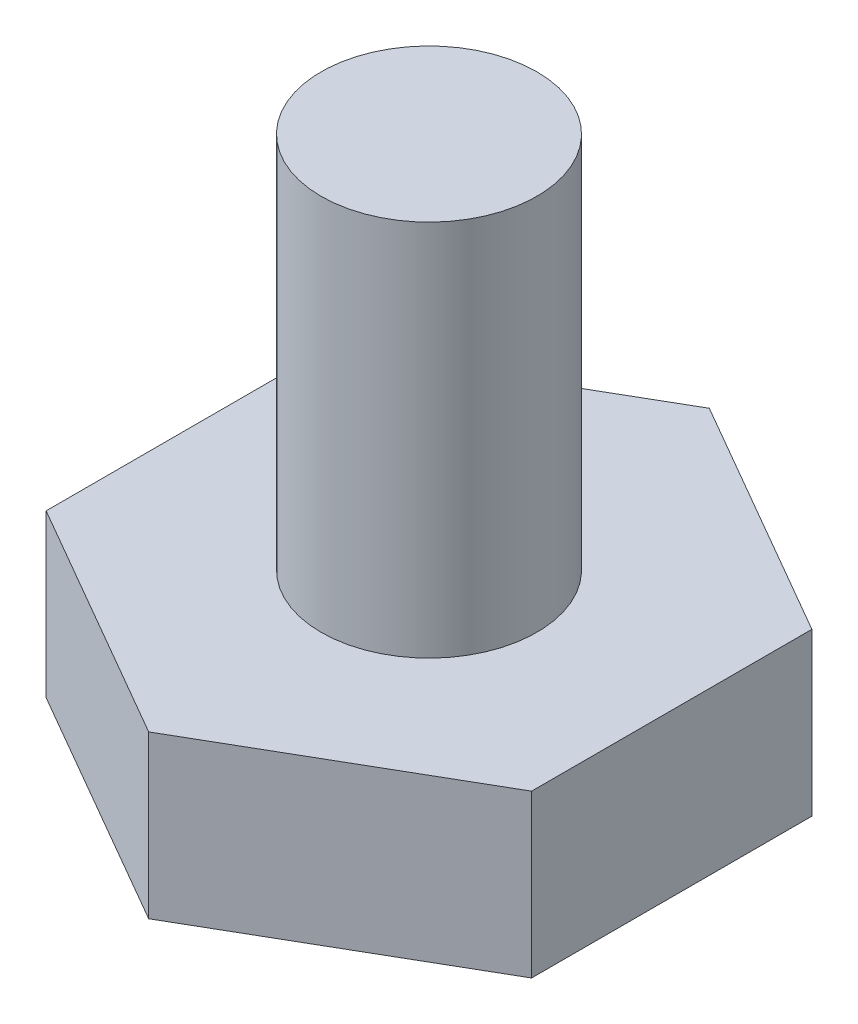
ISO-10303-21;
HEADER;
FILE_DESCRIPTION(('STEP AP214'),'2;1');
FILE_NAME('part.step','',(''),(''),'','','');
FILE_SCHEMA(('AUTOMOTIVE_DESIGN { 1 0 10303 214 1 1 1 1 }'));
ENDSEC;
DATA;
#1=APPLICATION_CONTEXT('core data for automotive mechanical design processes');
#2=APPLICATION_PROTOCOL_DEFINITION('international standard','automotive_design',2000,#1);
#3=PRODUCT_CONTEXT('',#1,'mechanical');
#4=PRODUCT('Part','Part','',(#3));
#5=PRODUCT_RELATED_PRODUCT_CATEGORY('part','',(#4));
#6=PRODUCT_DEFINITION_FORMATION('','',#4);
#7=PRODUCT_DEFINITION_CONTEXT('part definition',#1,'design');
#8=PRODUCT_DEFINITION('design','',#6,#7);
#9=PRODUCT_DEFINITION_SHAPE('','',#8);
#10=(LENGTH_UNIT() NAMED_UNIT(*) SI_UNIT(.MILLI.,.METRE.));
#11=(NAMED_UNIT(*) PLANE_ANGLE_UNIT() SI_UNIT($,.RADIAN.));
#12=(NAMED_UNIT(*) SI_UNIT($,.STERADIAN.) SOLID_ANGLE_UNIT());
#13=UNCERTAINTY_MEASURE_WITH_UNIT(LENGTH_MEASURE(1.E-05),#10,'distance_accuracy_value','');
#14=(GEOMETRIC_REPRESENTATION_CONTEXT(3) GLOBAL_UNCERTAINTY_ASSIGNED_CONTEXT((#13)) GLOBAL_UNIT_ASSIGNED_CONTEXT((#10,
#11,#12)) REPRESENTATION_CONTEXT('',''));
#15=CARTESIAN_POINT('',(0.,0.,0.));
#16=DIRECTION('',(0.,0.,1.));
#17=DIRECTION('',(1.,0.,0.));
#18=AXIS2_PLACEMENT_3D('',#15,#16,#17);
#19=CARTESIAN_POINT('',(7.14374999999995,2.38125,-4.12444598552347));
#20=DIRECTION('',(-0.499999999999995,0.,0.866025403784442));
#21=DIRECTION('',(0.866025403784442,0.,0.499999999999995));
#22=AXIS2_PLACEMENT_3D('',#19,#20,#21);
#23=PLANE('',#22);
#24=DIRECTION('',(-0.866025403784441,0.,-0.499999999999995));
#25=VECTOR('',#24,1.);
#26=CARTESIAN_POINT('',(7.14374999999995,-2.38125,-4.12444598552347));
#27=LINE('',#26,#25);
#28=CARTESIAN_POINT('',(7.14374999999995,-2.38125,-4.12444598552347));
#29=VERTEX_POINT('',#28);
#30=CARTESIAN_POINT('',(0.,-2.38125,-8.24889197104678));
#31=VERTEX_POINT('',#30);
#32=EDGE_CURVE('E125',#29,#31,#27,.T.);
#33=ORIENTED_EDGE('',*,*,#32,.T.);
#34=DIRECTION('',(0.,-1.,0.));
#35=VECTOR('',#34,1.);
#36=CARTESIAN_POINT('',(0.,2.38125,-8.24889197104678));
#37=LINE('',#36,#35);
#38=CARTESIAN_POINT('',(0.,2.38125,-8.24889197104678));
#39=VERTEX_POINT('',#38);
#40=EDGE_CURVE('E42',#39,#31,#37,.T.);
#41=ORIENTED_EDGE('',*,*,#40,.F.);
#42=DIRECTION('',(-0.866025403784441,0.,-0.499999999999995));
#43=VECTOR('',#42,1.);
#44=CARTESIAN_POINT('',(7.14374999999995,2.38125,-4.12444598552347));
#45=LINE('',#44,#43);
#46=CARTESIAN_POINT('',(7.14374999999995,2.38125,-4.12444598552347));
#47=VERTEX_POINT('',#46);
#48=EDGE_CURVE('E136',#47,#39,#45,.T.);
#49=ORIENTED_EDGE('',*,*,#48,.F.);
#50=DIRECTION('',(0.,-1.,0.));
#51=VECTOR('',#50,1.);
#52=CARTESIAN_POINT('',(7.14374999999995,2.38125,-4.12444598552347));
#53=LINE('',#52,#51);
#54=EDGE_CURVE('E121',#47,#29,#53,.T.);
#55=ORIENTED_EDGE('',*,*,#54,.T.);
#56=EDGE_LOOP('',(#33,#41,#49,#55));
#57=FACE_BOUND('',#56,.T.);
#58=ADVANCED_FACE('F39',(#57),#23,.F.);
#59=CARTESIAN_POINT('',(0.,2.38125,-8.24889197104678));
#60=DIRECTION('',(0.500000000000001,0.,0.866025403784438));
#61=DIRECTION('',(0.866025403784438,0.,-0.500000000000001));
#62=AXIS2_PLACEMENT_3D('',#59,#60,#61);
#63=PLANE('',#62);
#64=DIRECTION('',(-0.866025403784438,0.,0.500000000000001));
#65=VECTOR('',#64,1.);
#66=CARTESIAN_POINT('',(0.,-2.38125,-8.24889197104678));
#67=LINE('',#66,#65);
#68=CARTESIAN_POINT('',(-7.14375000000001,-2.38125,-4.12444598552337));
#69=VERTEX_POINT('',#68);
#70=EDGE_CURVE('E128',#31,#69,#67,.T.);
#71=ORIENTED_EDGE('',*,*,#70,.T.);
#72=DIRECTION('',(0.,-1.,0.));
#73=VECTOR('',#72,1.);
#74=CARTESIAN_POINT('',(-7.14375000000001,2.38125,-4.12444598552337));
#75=LINE('',#74,#73);
#76=CARTESIAN_POINT('',(-7.14375000000001,2.38125,-4.12444598552337));
#77=VERTEX_POINT('',#76);
#78=EDGE_CURVE('E139',#77,#69,#75,.T.);
#79=ORIENTED_EDGE('',*,*,#78,.F.);
#80=DIRECTION('',(-0.866025403784438,0.,0.500000000000001));
#81=VECTOR('',#80,1.);
#82=CARTESIAN_POINT('',(0.,2.38125,-8.24889197104678));
#83=LINE('',#82,#81);
#84=EDGE_CURVE('E94',#39,#77,#83,.T.);
#85=ORIENTED_EDGE('',*,*,#84,.F.);
#86=ORIENTED_EDGE('',*,*,#40,.T.);
#87=EDGE_LOOP('',(#71,#79,#85,#86));
#88=FACE_BOUND('',#87,.T.);
#89=ADVANCED_FACE('F144',(#88),#63,.F.);
#90=CARTESIAN_POINT('',(-7.14375000000001,2.38125,-4.12444598552337));
#91=DIRECTION('',(1.,0.,0.));
#92=DIRECTION('',(0.,0.,-1.));
#93=AXIS2_PLACEMENT_3D('',#90,#91,#92);
#94=PLANE('',#93);
#95=DIRECTION('',(0.,0.,1.));
#96=VECTOR('',#95,1.);
#97=CARTESIAN_POINT('',(-7.14375000000001,-2.38125,-4.12444598552337));
#98=LINE('',#97,#96);
#99=CARTESIAN_POINT('',(-7.14374999999998,-2.38125,4.12444598552342));
#100=VERTEX_POINT('',#99);
#101=EDGE_CURVE('E131',#69,#100,#98,.T.);
#102=ORIENTED_EDGE('',*,*,#101,.T.);
#103=DIRECTION('',(0.,-1.,0.));
#104=VECTOR('',#103,1.);
#105=CARTESIAN_POINT('',(-7.14374999999998,2.38125,4.12444598552342));
#106=LINE('',#105,#104);
#107=CARTESIAN_POINT('',(-7.14374999999998,2.38125,4.12444598552342));
#108=VERTEX_POINT('',#107);
#109=EDGE_CURVE('E116',#108,#100,#106,.T.);
#110=ORIENTED_EDGE('',*,*,#109,.F.);
#111=DIRECTION('',(0.,0.,1.));
#112=VECTOR('',#111,1.);
#113=CARTESIAN_POINT('',(-7.14375000000001,2.38125,-4.12444598552337));
#114=LINE('',#113,#112);
#115=EDGE_CURVE('E107',#77,#108,#114,.T.);
#116=ORIENTED_EDGE('',*,*,#115,.F.);
#117=ORIENTED_EDGE('',*,*,#78,.T.);
#118=EDGE_LOOP('',(#102,#110,#116,#117));
#119=FACE_BOUND('',#118,.T.);
#120=ADVANCED_FACE('F150',(#119),#94,.F.);
#121=CARTESIAN_POINT('',(-7.14374999999998,2.38125,4.12444598552342));
#122=DIRECTION('',(0.499999999999995,0.,-0.866025403784442));
#123=DIRECTION('',(-0.866025403784442,0.,-0.499999999999995));
#124=AXIS2_PLACEMENT_3D('',#121,#122,#123);
#125=PLANE('',#124);
#126=DIRECTION('',(0.866025403784442,0.,0.499999999999995));
#127=VECTOR('',#126,1.);
#128=CARTESIAN_POINT('',(-7.14374999999998,-2.38125,4.12444598552342));
#129=LINE('',#128,#127);
#130=CARTESIAN_POINT('',(0.,-2.38125,8.24889197104677));
#131=VERTEX_POINT('',#130);
#132=EDGE_CURVE('E115',#100,#131,#129,.T.);
#133=ORIENTED_EDGE('',*,*,#132,.T.);
#134=DIRECTION('',(0.,-1.,0.));
#135=VECTOR('',#134,1.);
#136=CARTESIAN_POINT('',(0.,2.38125,8.24889197104677));
#137=LINE('',#136,#135);
#138=CARTESIAN_POINT('',(0.,2.38125,8.24889197104677));
#139=VERTEX_POINT('',#138);
#140=EDGE_CURVE('E112',#139,#131,#137,.T.);
#141=ORIENTED_EDGE('',*,*,#140,.F.);
#142=DIRECTION('',(0.866025403784442,0.,0.499999999999995));
#143=VECTOR('',#142,1.);
#144=CARTESIAN_POINT('',(-7.14374999999998,2.38125,4.12444598552342));
#145=LINE('',#144,#143);
#146=EDGE_CURVE('E101',#108,#139,#145,.T.);
#147=ORIENTED_EDGE('',*,*,#146,.F.);
#148=ORIENTED_EDGE('',*,*,#109,.T.);
#149=EDGE_LOOP('',(#133,#141,#147,#148));
#150=FACE_BOUND('',#149,.T.);
#151=ADVANCED_FACE('F113',(#150),#125,.F.);
#152=CARTESIAN_POINT('',(0.,2.38125,8.24889197104677));
#153=DIRECTION('',(-0.500000000000007,0.,-0.866025403784435));
#154=DIRECTION('',(-0.866025403784435,0.,0.500000000000007));
#155=AXIS2_PLACEMENT_3D('',#152,#153,#154);
#156=PLANE('',#155);
#157=DIRECTION('',(0.866025403784435,0.,-0.500000000000007));
#158=VECTOR('',#157,1.);
#159=CARTESIAN_POINT('',(0.,-2.38125,8.24889197104677));
#160=LINE('',#159,#158);
#161=CARTESIAN_POINT('',(7.14375000000004,-2.38125,4.12444598552332));
#162=VERTEX_POINT('',#161);
#163=EDGE_CURVE('E79',#131,#162,#160,.T.);
#164=ORIENTED_EDGE('',*,*,#163,.T.);
#165=DIRECTION('',(0.,-1.,0.));
#166=VECTOR('',#165,1.);
#167=CARTESIAN_POINT('',(7.14375000000004,2.38125,4.12444598552332));
#168=LINE('',#167,#166);
#169=CARTESIAN_POINT('',(7.14375000000004,2.38125,4.12444598552332));
#170=VERTEX_POINT('',#169);
#171=EDGE_CURVE('E117',#170,#162,#168,.T.);
#172=ORIENTED_EDGE('',*,*,#171,.F.);
#173=DIRECTION('',(0.866025403784435,0.,-0.500000000000007));
#174=VECTOR('',#173,1.);
#175=CARTESIAN_POINT('',(0.,2.38125,8.24889197104677));
#176=LINE('',#175,#174);
#177=EDGE_CURVE('E105',#139,#170,#176,.T.);
#178=ORIENTED_EDGE('',*,*,#177,.F.);
#179=ORIENTED_EDGE('',*,*,#140,.T.);
#180=EDGE_LOOP('',(#164,#172,#178,#179));
#181=FACE_BOUND('',#180,.T.);
#182=ADVANCED_FACE('F119',(#181),#156,.F.);
#183=CARTESIAN_POINT('',(7.14375000000004,2.38125,4.12444598552332));
#184=DIRECTION('',(-1.,0.,0.));
#185=DIRECTION('',(0.,0.,1.));
#186=AXIS2_PLACEMENT_3D('',#183,#184,#185);
#187=PLANE('',#186);
#188=DIRECTION('',(0.,0.,-1.));
#189=VECTOR('',#188,1.);
#190=CARTESIAN_POINT('',(7.14375000000004,-2.38125,4.12444598552332));
#191=LINE('',#190,#189);
#192=EDGE_CURVE('E85',#162,#29,#191,.T.);
#193=ORIENTED_EDGE('',*,*,#192,.T.);
#194=ORIENTED_EDGE('',*,*,#54,.F.);
#195=DIRECTION('',(0.,0.,-1.));
#196=VECTOR('',#195,1.);
#197=CARTESIAN_POINT('',(7.14375000000004,2.38125,4.12444598552332));
#198=LINE('',#197,#196);
#199=EDGE_CURVE('E56',#170,#47,#198,.T.);
#200=ORIENTED_EDGE('',*,*,#199,.F.);
#201=ORIENTED_EDGE('',*,*,#171,.T.);
#202=EDGE_LOOP('',(#193,#194,#200,#201));
#203=FACE_BOUND('',#202,.T.);
#204=ADVANCED_FACE('F166',(#203),#187,.F.);
#205=CARTESIAN_POINT('',(0.,2.38125,0.));
#206=DIRECTION('',(0.,1.,0.));
#207=DIRECTION('',(0.,0.,1.));
#208=AXIS2_PLACEMENT_3D('',#205,#206,#207);
#209=PLANE('',#208);
#210=CARTESIAN_POINT('',(0.,2.38125,0.));
#211=DIRECTION('',(0.,1.,0.));
#212=DIRECTION('',(0.,0.,1.));
#213=AXIS2_PLACEMENT_3D('',#210,#211,#212);
#214=CIRCLE('',#213,3.175);
#215=CARTESIAN_POINT('',(0.,2.38125,3.175));
#216=VERTEX_POINT('',#215);
#217=EDGE_CURVE('E11',#216,#216,#214,.T.);
#218=ORIENTED_EDGE('',*,*,#217,.F.);
#219=EDGE_LOOP('',(#218));
#220=FACE_BOUND('',#219,.T.);
#221=ORIENTED_EDGE('',*,*,#48,.T.);
#222=ORIENTED_EDGE('',*,*,#84,.T.);
#223=ORIENTED_EDGE('',*,*,#115,.T.);
#224=ORIENTED_EDGE('',*,*,#146,.T.);
#225=ORIENTED_EDGE('',*,*,#177,.T.);
#226=ORIENTED_EDGE('',*,*,#199,.T.);
#227=EDGE_LOOP('',(#221,#222,#223,#224,#225,#226));
#228=FACE_BOUND('',#227,.T.);
#229=ADVANCED_FACE('F103',(#220,#228),#209,.T.);
#230=CARTESIAN_POINT('',(0.,-2.38125,0.));
#231=DIRECTION('',(0.,1.,0.));
#232=DIRECTION('',(0.,0.,1.));
#233=AXIS2_PLACEMENT_3D('',#230,#231,#232);
#234=PLANE('',#233);
#235=ORIENTED_EDGE('',*,*,#32,.F.);
#236=ORIENTED_EDGE('',*,*,#192,.F.);
#237=ORIENTED_EDGE('',*,*,#163,.F.);
#238=ORIENTED_EDGE('',*,*,#132,.F.);
#239=ORIENTED_EDGE('',*,*,#101,.F.);
#240=ORIENTED_EDGE('',*,*,#70,.F.);
#241=EDGE_LOOP('',(#235,#236,#237,#238,#239,#240));
#242=FACE_BOUND('',#241,.T.);
#243=ADVANCED_FACE('F149',(#242),#234,.F.);
#244=CARTESIAN_POINT('',(0.,13.49375,0.));
#245=DIRECTION('',(0.,-1.,0.));
#246=DIRECTION('',(0.,0.,-1.));
#247=AXIS2_PLACEMENT_3D('',#244,#245,#246);
#248=CYLINDRICAL_SURFACE('',#247,3.175);
#249=CARTESIAN_POINT('',(0.,13.49375,0.));
#250=DIRECTION('',(0.,1.,0.));
#251=DIRECTION('',(0.,0.,1.));
#252=AXIS2_PLACEMENT_3D('',#249,#250,#251);
#253=CIRCLE('',#252,3.175);
#254=CARTESIAN_POINT('',(0.,13.49375,3.175));
#255=VERTEX_POINT('',#254);
#256=EDGE_CURVE('E129',#255,#255,#253,.T.);
#257=ORIENTED_EDGE('',*,*,#256,.F.);
#258=EDGE_LOOP('',(#257));
#259=FACE_BOUND('',#258,.T.);
#260=ORIENTED_EDGE('',*,*,#217,.T.);
#261=EDGE_LOOP('',(#260));
#262=FACE_BOUND('',#261,.T.);
#263=ADVANCED_FACE('F159',(#259,#262),#248,.T.);
#264=CARTESIAN_POINT('',(0.,13.49375,0.));
#265=DIRECTION('',(0.,1.,0.));
#266=DIRECTION('',(0.,0.,1.));
#267=AXIS2_PLACEMENT_3D('',#264,#265,#266);
#268=PLANE('',#267);
#269=ORIENTED_EDGE('',*,*,#256,.T.);
#270=EDGE_LOOP('',(#269));
#271=FACE_BOUND('',#270,.T.);
#272=ADVANCED_FACE('F157',(#271),#268,.T.);
#273=CLOSED_SHELL('',(#58,#89,#120,#151,#182,#204,#229,#243,#263,#272));
#274=MANIFOLD_SOLID_BREP('B2',#273);
#275=ADVANCED_BREP_SHAPE_REPRESENTATION('',(#18,#274),#14);
#276=SHAPE_DEFINITION_REPRESENTATION(#9,#275);
ENDSEC;
END-ISO-10303-21;
